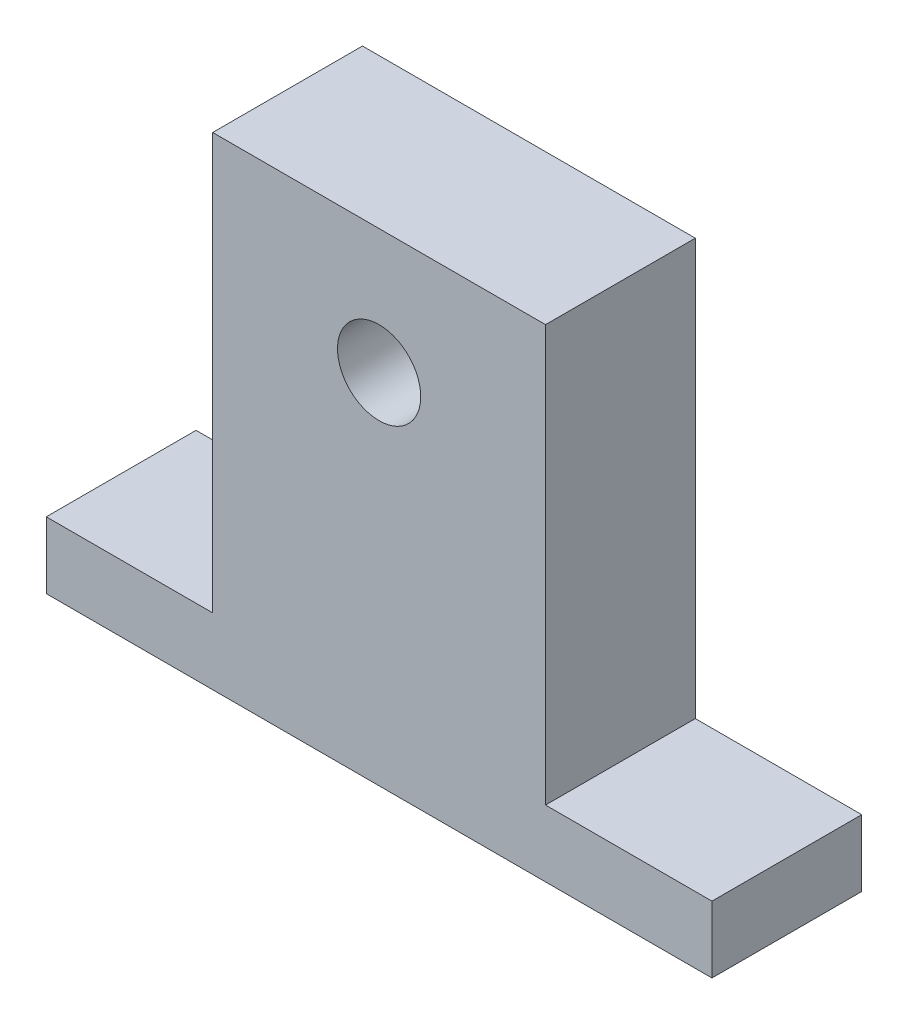
ISO-10303-21;
HEADER;
FILE_DESCRIPTION(('STEP AP214'),'2;1');
FILE_NAME('part.step','',(''),(''),'','','');
FILE_SCHEMA(('AUTOMOTIVE_DESIGN { 1 0 10303 214 1 1 1 1 }'));
ENDSEC;
DATA;
#1=APPLICATION_CONTEXT('core data for automotive mechanical design processes');
#2=APPLICATION_PROTOCOL_DEFINITION('international standard','automotive_design',2000,#1);
#3=PRODUCT_CONTEXT('',#1,'mechanical');
#4=PRODUCT('Part','Part','',(#3));
#5=PRODUCT_RELATED_PRODUCT_CATEGORY('part','',(#4));
#6=PRODUCT_DEFINITION_FORMATION('','',#4);
#7=PRODUCT_DEFINITION_CONTEXT('part definition',#1,'design');
#8=PRODUCT_DEFINITION('design','',#6,#7);
#9=PRODUCT_DEFINITION_SHAPE('','',#8);
#10=(LENGTH_UNIT() NAMED_UNIT(*) SI_UNIT(.MILLI.,.METRE.));
#11=(NAMED_UNIT(*) PLANE_ANGLE_UNIT() SI_UNIT($,.RADIAN.));
#12=(NAMED_UNIT(*) SI_UNIT($,.STERADIAN.) SOLID_ANGLE_UNIT());
#13=UNCERTAINTY_MEASURE_WITH_UNIT(LENGTH_MEASURE(1.E-05),#10,'distance_accuracy_value','');
#14=(GEOMETRIC_REPRESENTATION_CONTEXT(3) GLOBAL_UNCERTAINTY_ASSIGNED_CONTEXT((#13)) GLOBAL_UNIT_ASSIGNED_CONTEXT((#10,
#11,#12)) REPRESENTATION_CONTEXT('',''));
#15=CARTESIAN_POINT('',(0.,0.,0.));
#16=DIRECTION('',(0.,0.,1.));
#17=DIRECTION('',(1.,0.,0.));
#18=AXIS2_PLACEMENT_3D('',#15,#16,#17);
#19=CARTESIAN_POINT('',(-70.,3.99999999999999,-9.));
#20=DIRECTION('',(1.,0.,0.));
#21=DIRECTION('',(0.,0.,-1.));
#22=AXIS2_PLACEMENT_3D('',#19,#20,#21);
#23=PLANE('',#22);
#24=DIRECTION('',(0.,1.,0.));
#25=VECTOR('',#24,1.);
#26=CARTESIAN_POINT('',(-70.,3.99999999999999,0.));
#27=LINE('',#26,#25);
#28=CARTESIAN_POINT('',(-70.,3.99999999999999,0.));
#29=VERTEX_POINT('',#28);
#30=CARTESIAN_POINT('',(-70.,29.,0.));
#31=VERTEX_POINT('',#30);
#32=EDGE_CURVE('E129',#29,#31,#27,.T.);
#33=ORIENTED_EDGE('',*,*,#32,.T.);
#34=DIRECTION('',(0.,0.,1.));
#35=VECTOR('',#34,1.);
#36=CARTESIAN_POINT('',(-70.,29.,-9.));
#37=LINE('',#36,#35);
#38=CARTESIAN_POINT('',(-70.,29.,-9.));
#39=VERTEX_POINT('',#38);
#40=EDGE_CURVE('E11',#39,#31,#37,.T.);
#41=ORIENTED_EDGE('',*,*,#40,.F.);
#42=DIRECTION('',(0.,1.,0.));
#43=VECTOR('',#42,1.);
#44=CARTESIAN_POINT('',(-70.,3.99999999999999,-9.));
#45=LINE('',#44,#43);
#46=CARTESIAN_POINT('',(-70.,3.99999999999999,-9.));
#47=VERTEX_POINT('',#46);
#48=EDGE_CURVE('E144',#47,#39,#45,.T.);
#49=ORIENTED_EDGE('',*,*,#48,.F.);
#50=DIRECTION('',(0.,0.,1.));
#51=VECTOR('',#50,1.);
#52=CARTESIAN_POINT('',(-70.,3.99999999999999,-9.));
#53=LINE('',#52,#51);
#54=EDGE_CURVE('E125',#47,#29,#53,.T.);
#55=ORIENTED_EDGE('',*,*,#54,.T.);
#56=EDGE_LOOP('',(#33,#41,#49,#55));
#57=FACE_BOUND('',#56,.T.);
#58=ADVANCED_FACE('F33',(#57),#23,.F.);
#59=CARTESIAN_POINT('',(-70.,29.,-9.));
#60=DIRECTION('',(0.,-1.,0.));
#61=DIRECTION('',(1.,0.,0.));
#62=AXIS2_PLACEMENT_3D('',#59,#60,#61);
#63=PLANE('',#62);
#64=DIRECTION('',(1.,0.,0.));
#65=VECTOR('',#64,1.);
#66=CARTESIAN_POINT('',(-70.,29.,0.));
#67=LINE('',#66,#65);
#68=CARTESIAN_POINT('',(-50.,29.,0.));
#69=VERTEX_POINT('',#68);
#70=EDGE_CURVE('E132',#31,#69,#67,.T.);
#71=ORIENTED_EDGE('',*,*,#70,.T.);
#72=DIRECTION('',(0.,0.,1.));
#73=VECTOR('',#72,1.);
#74=CARTESIAN_POINT('',(-50.,29.,-9.));
#75=LINE('',#74,#73);
#76=CARTESIAN_POINT('',(-50.,29.,-9.));
#77=VERTEX_POINT('',#76);
#78=EDGE_CURVE('E41',#77,#69,#75,.T.);
#79=ORIENTED_EDGE('',*,*,#78,.F.);
#80=DIRECTION('',(1.,0.,0.));
#81=VECTOR('',#80,1.);
#82=CARTESIAN_POINT('',(-70.,29.,-9.));
#83=LINE('',#82,#81);
#84=EDGE_CURVE('E92',#39,#77,#83,.T.);
#85=ORIENTED_EDGE('',*,*,#84,.F.);
#86=ORIENTED_EDGE('',*,*,#40,.T.);
#87=EDGE_LOOP('',(#71,#79,#85,#86));
#88=FACE_BOUND('',#87,.T.);
#89=ADVANCED_FACE('F199',(#88),#63,.F.);
#90=CARTESIAN_POINT('',(-50.,29.,-9.));
#91=DIRECTION('',(-1.,0.,0.));
#92=DIRECTION('',(0.,-1.,0.));
#93=AXIS2_PLACEMENT_3D('',#90,#91,#92);
#94=PLANE('',#93);
#95=DIRECTION('',(0.,-1.,0.));
#96=VECTOR('',#95,1.);
#97=CARTESIAN_POINT('',(-50.,29.,0.));
#98=LINE('',#97,#96);
#99=CARTESIAN_POINT('',(-50.,4.,0.));
#100=VERTEX_POINT('',#99);
#101=EDGE_CURVE('E135',#69,#100,#98,.T.);
#102=ORIENTED_EDGE('',*,*,#101,.T.);
#103=DIRECTION('',(0.,0.,1.));
#104=VECTOR('',#103,1.);
#105=CARTESIAN_POINT('',(-50.,4.,-9.));
#106=LINE('',#105,#104);
#107=CARTESIAN_POINT('',(-50.,4.,-9.));
#108=VERTEX_POINT('',#107);
#109=EDGE_CURVE('E151',#108,#100,#106,.T.);
#110=ORIENTED_EDGE('',*,*,#109,.F.);
#111=DIRECTION('',(0.,-1.,0.));
#112=VECTOR('',#111,1.);
#113=CARTESIAN_POINT('',(-50.,29.,-9.));
#114=LINE('',#113,#112);
#115=EDGE_CURVE('E159',#77,#108,#114,.T.);
#116=ORIENTED_EDGE('',*,*,#115,.F.);
#117=ORIENTED_EDGE('',*,*,#78,.T.);
#118=EDGE_LOOP('',(#102,#110,#116,#117));
#119=FACE_BOUND('',#118,.T.);
#120=ADVANCED_FACE('F157',(#119),#94,.F.);
#121=CARTESIAN_POINT('',(-50.,4.,-9.));
#122=DIRECTION('',(0.,-1.,0.));
#123=DIRECTION('',(0.,0.,-1.));
#124=AXIS2_PLACEMENT_3D('',#121,#122,#123);
#125=PLANE('',#124);
#126=DIRECTION('',(1.,0.,0.));
#127=VECTOR('',#126,1.);
#128=CARTESIAN_POINT('',(-50.,4.,0.));
#129=LINE('',#128,#127);
#130=CARTESIAN_POINT('',(-40.,4.,0.));
#131=VERTEX_POINT('',#130);
#132=EDGE_CURVE('E137',#100,#131,#129,.T.);
#133=ORIENTED_EDGE('',*,*,#132,.T.);
#134=DIRECTION('',(0.,0.,1.));
#135=VECTOR('',#134,1.);
#136=CARTESIAN_POINT('',(-40.,4.,-9.));
#137=LINE('',#136,#135);
#138=CARTESIAN_POINT('',(-40.,4.,-9.));
#139=VERTEX_POINT('',#138);
#140=EDGE_CURVE('E148',#139,#131,#137,.T.);
#141=ORIENTED_EDGE('',*,*,#140,.F.);
#142=DIRECTION('',(1.,0.,0.));
#143=VECTOR('',#142,1.);
#144=CARTESIAN_POINT('',(-50.,4.,-9.));
#145=LINE('',#144,#143);
#146=EDGE_CURVE('E171',#108,#139,#145,.T.);
#147=ORIENTED_EDGE('',*,*,#146,.F.);
#148=ORIENTED_EDGE('',*,*,#109,.T.);
#149=EDGE_LOOP('',(#133,#141,#147,#148));
#150=FACE_BOUND('',#149,.T.);
#151=ADVANCED_FACE('F167',(#150),#125,.F.);
#152=CARTESIAN_POINT('',(-40.,4.,-9.));
#153=DIRECTION('',(-1.,0.,0.));
#154=DIRECTION('',(0.,-1.,0.));
#155=AXIS2_PLACEMENT_3D('',#152,#153,#154);
#156=PLANE('',#155);
#157=DIRECTION('',(0.,-1.,0.));
#158=VECTOR('',#157,1.);
#159=CARTESIAN_POINT('',(-40.,4.,0.));
#160=LINE('',#159,#158);
#161=CARTESIAN_POINT('',(-40.,0.,0.));
#162=VERTEX_POINT('',#161);
#163=EDGE_CURVE('E139',#131,#162,#160,.T.);
#164=ORIENTED_EDGE('',*,*,#163,.T.);
#165=DIRECTION('',(0.,0.,1.));
#166=VECTOR('',#165,1.);
#167=CARTESIAN_POINT('',(-40.,0.,-9.));
#168=LINE('',#167,#166);
#169=CARTESIAN_POINT('',(-40.,0.,-9.));
#170=VERTEX_POINT('',#169);
#171=EDGE_CURVE('E120',#170,#162,#168,.T.);
#172=ORIENTED_EDGE('',*,*,#171,.F.);
#173=DIRECTION('',(0.,-1.,0.));
#174=VECTOR('',#173,1.);
#175=CARTESIAN_POINT('',(-40.,4.,-9.));
#176=LINE('',#175,#174);
#177=EDGE_CURVE('E111',#139,#170,#176,.T.);
#178=ORIENTED_EDGE('',*,*,#177,.F.);
#179=ORIENTED_EDGE('',*,*,#140,.T.);
#180=EDGE_LOOP('',(#164,#172,#178,#179));
#181=FACE_BOUND('',#180,.T.);
#182=ADVANCED_FACE('F170',(#181),#156,.F.);
#183=CARTESIAN_POINT('',(-40.,0.,-9.));
#184=DIRECTION('',(0.,1.,0.));
#185=DIRECTION('',(-1.,0.,0.));
#186=AXIS2_PLACEMENT_3D('',#183,#184,#185);
#187=PLANE('',#186);
#188=DIRECTION('',(-1.,0.,0.));
#189=VECTOR('',#188,1.);
#190=CARTESIAN_POINT('',(-40.,0.,0.));
#191=LINE('',#190,#189);
#192=CARTESIAN_POINT('',(-80.,0.,0.));
#193=VERTEX_POINT('',#192);
#194=EDGE_CURVE('E119',#162,#193,#191,.T.);
#195=ORIENTED_EDGE('',*,*,#194,.T.);
#196=DIRECTION('',(0.,0.,1.));
#197=VECTOR('',#196,1.);
#198=CARTESIAN_POINT('',(-80.,0.,-9.));
#199=LINE('',#198,#197);
#200=CARTESIAN_POINT('',(-80.,0.,-9.));
#201=VERTEX_POINT('',#200);
#202=EDGE_CURVE('E116',#201,#193,#199,.T.);
#203=ORIENTED_EDGE('',*,*,#202,.F.);
#204=DIRECTION('',(-1.,0.,0.));
#205=VECTOR('',#204,1.);
#206=CARTESIAN_POINT('',(-40.,0.,-9.));
#207=LINE('',#206,#205);
#208=EDGE_CURVE('E105',#170,#201,#207,.T.);
#209=ORIENTED_EDGE('',*,*,#208,.F.);
#210=ORIENTED_EDGE('',*,*,#171,.T.);
#211=EDGE_LOOP('',(#195,#203,#209,#210));
#212=FACE_BOUND('',#211,.T.);
#213=ADVANCED_FACE('F117',(#212),#187,.F.);
#214=CARTESIAN_POINT('',(-80.,0.,-9.));
#215=DIRECTION('',(1.,0.,0.));
#216=DIRECTION('',(0.,0.,-1.));
#217=AXIS2_PLACEMENT_3D('',#214,#215,#216);
#218=PLANE('',#217);
#219=DIRECTION('',(0.,1.,0.));
#220=VECTOR('',#219,1.);
#221=CARTESIAN_POINT('',(-80.,0.,0.));
#222=LINE('',#221,#220);
#223=CARTESIAN_POINT('',(-80.,3.99999999999999,0.));
#224=VERTEX_POINT('',#223);
#225=EDGE_CURVE('E78',#193,#224,#222,.T.);
#226=ORIENTED_EDGE('',*,*,#225,.T.);
#227=DIRECTION('',(0.,0.,1.));
#228=VECTOR('',#227,1.);
#229=CARTESIAN_POINT('',(-80.,3.99999999999999,-9.));
#230=LINE('',#229,#228);
#231=CARTESIAN_POINT('',(-80.,3.99999999999999,-9.));
#232=VERTEX_POINT('',#231);
#233=EDGE_CURVE('E121',#232,#224,#230,.T.);
#234=ORIENTED_EDGE('',*,*,#233,.F.);
#235=DIRECTION('',(0.,1.,0.));
#236=VECTOR('',#235,1.);
#237=CARTESIAN_POINT('',(-80.,0.,-9.));
#238=LINE('',#237,#236);
#239=EDGE_CURVE('E109',#201,#232,#238,.T.);
#240=ORIENTED_EDGE('',*,*,#239,.F.);
#241=ORIENTED_EDGE('',*,*,#202,.T.);
#242=EDGE_LOOP('',(#226,#234,#240,#241));
#243=FACE_BOUND('',#242,.T.);
#244=ADVANCED_FACE('F123',(#243),#218,.F.);
#245=CARTESIAN_POINT('',(-80.,3.99999999999999,-9.));
#246=DIRECTION('',(0.,-1.,0.));
#247=DIRECTION('',(0.,0.,-1.));
#248=AXIS2_PLACEMENT_3D('',#245,#246,#247);
#249=PLANE('',#248);
#250=DIRECTION('',(1.,0.,0.));
#251=VECTOR('',#250,1.);
#252=CARTESIAN_POINT('',(-80.,3.99999999999999,0.));
#253=LINE('',#252,#251);
#254=EDGE_CURVE('E84',#224,#29,#253,.T.);
#255=ORIENTED_EDGE('',*,*,#254,.T.);
#256=ORIENTED_EDGE('',*,*,#54,.F.);
#257=DIRECTION('',(1.,0.,0.));
#258=VECTOR('',#257,1.);
#259=CARTESIAN_POINT('',(-80.,3.99999999999999,-9.));
#260=LINE('',#259,#258);
#261=EDGE_CURVE('E49',#232,#47,#260,.T.);
#262=ORIENTED_EDGE('',*,*,#261,.F.);
#263=ORIENTED_EDGE('',*,*,#233,.T.);
#264=EDGE_LOOP('',(#255,#256,#262,#263));
#265=FACE_BOUND('',#264,.T.);
#266=ADVANCED_FACE('F195',(#265),#249,.F.);
#267=CARTESIAN_POINT('',(0.,0.,-9.));
#268=DIRECTION('',(0.,0.,-1.));
#269=DIRECTION('',(-1.,0.,0.));
#270=AXIS2_PLACEMENT_3D('',#267,#268,#269);
#271=PLANE('',#270);
#272=CARTESIAN_POINT('',(-60.,21.5,-9.));
#273=DIRECTION('',(0.,0.,1.));
#274=DIRECTION('',(1.,0.,0.));
#275=AXIS2_PLACEMENT_3D('',#272,#273,#274);
#276=CIRCLE('',#275,2.5);
#277=CARTESIAN_POINT('',(-57.5,21.5,-9.));
#278=VERTEX_POINT('',#277);
#279=EDGE_CURVE('E133',#278,#278,#276,.T.);
#280=ORIENTED_EDGE('',*,*,#279,.T.);
#281=EDGE_LOOP('',(#280));
#282=FACE_BOUND('',#281,.T.);
#283=ORIENTED_EDGE('',*,*,#48,.T.);
#284=ORIENTED_EDGE('',*,*,#84,.T.);
#285=ORIENTED_EDGE('',*,*,#115,.T.);
#286=ORIENTED_EDGE('',*,*,#146,.T.);
#287=ORIENTED_EDGE('',*,*,#177,.T.);
#288=ORIENTED_EDGE('',*,*,#208,.T.);
#289=ORIENTED_EDGE('',*,*,#239,.T.);
#290=ORIENTED_EDGE('',*,*,#261,.T.);
#291=EDGE_LOOP('',(#283,#284,#285,#286,#287,#288,#289,#290));
#292=FACE_BOUND('',#291,.T.);
#293=ADVANCED_FACE('F107',(#282,#292),#271,.T.);
#294=CARTESIAN_POINT('',(0.,0.,0.));
#295=DIRECTION('',(0.,0.,-1.));
#296=DIRECTION('',(-1.,0.,0.));
#297=AXIS2_PLACEMENT_3D('',#294,#295,#296);
#298=PLANE('',#297);
#299=CARTESIAN_POINT('',(-60.,21.5,0.));
#300=DIRECTION('',(0.,0.,1.));
#301=DIRECTION('',(1.,0.,0.));
#302=AXIS2_PLACEMENT_3D('',#299,#300,#301);
#303=CIRCLE('',#302,2.5);
#304=CARTESIAN_POINT('',(-57.5,21.5,0.));
#305=VERTEX_POINT('',#304);
#306=EDGE_CURVE('E177',#305,#305,#303,.T.);
#307=ORIENTED_EDGE('',*,*,#306,.F.);
#308=EDGE_LOOP('',(#307));
#309=FACE_BOUND('',#308,.T.);
#310=ORIENTED_EDGE('',*,*,#32,.F.);
#311=ORIENTED_EDGE('',*,*,#254,.F.);
#312=ORIENTED_EDGE('',*,*,#225,.F.);
#313=ORIENTED_EDGE('',*,*,#194,.F.);
#314=ORIENTED_EDGE('',*,*,#163,.F.);
#315=ORIENTED_EDGE('',*,*,#132,.F.);
#316=ORIENTED_EDGE('',*,*,#101,.F.);
#317=ORIENTED_EDGE('',*,*,#70,.F.);
#318=EDGE_LOOP('',(#310,#311,#312,#313,#314,#315,#316,#317));
#319=FACE_BOUND('',#318,.T.);
#320=ADVANCED_FACE('F163',(#309,#319),#298,.F.);
#321=CARTESIAN_POINT('',(-60.,21.5,-9.));
#322=DIRECTION('',(0.,0.,1.));
#323=DIRECTION('',(1.,0.,0.));
#324=AXIS2_PLACEMENT_3D('',#321,#322,#323);
#325=CYLINDRICAL_SURFACE('',#324,2.5);
#326=ORIENTED_EDGE('',*,*,#279,.F.);
#327=EDGE_LOOP('',(#326));
#328=FACE_BOUND('',#327,.T.);
#329=ORIENTED_EDGE('',*,*,#306,.T.);
#330=EDGE_LOOP('',(#329));
#331=FACE_BOUND('',#330,.T.);
#332=ADVANCED_FACE('F184',(#328,#331),#325,.F.);
#333=CLOSED_SHELL('',(#58,#89,#120,#151,#182,#213,#244,#266,#293,#320,#332));
#334=MANIFOLD_SOLID_BREP('B2',#333);
#335=ADVANCED_BREP_SHAPE_REPRESENTATION('',(#18,#334),#14);
#336=SHAPE_DEFINITION_REPRESENTATION(#9,#335);
ENDSEC;
END-ISO-10303-21;
